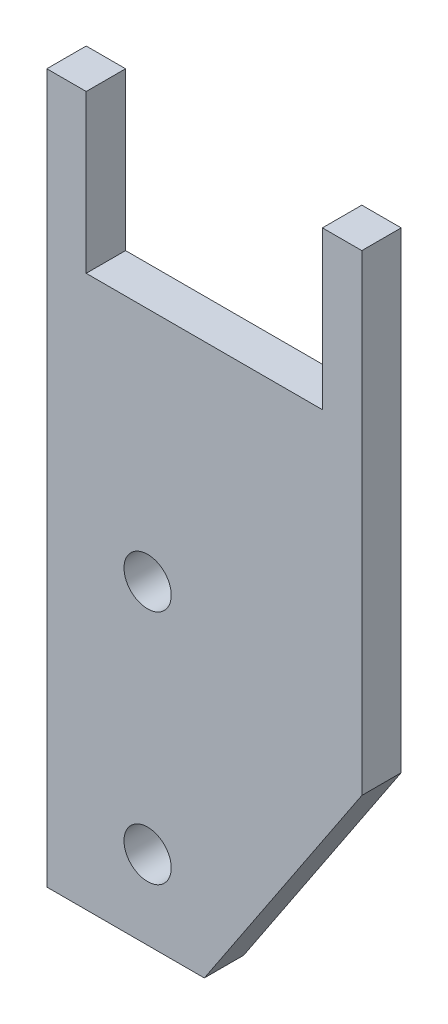
ISO-10303-21;
HEADER;
FILE_DESCRIPTION(('STEP AP214'),'2;1');
FILE_NAME('part.step','',(''),(''),'','','');
FILE_SCHEMA(('AUTOMOTIVE_DESIGN { 1 0 10303 214 1 1 1 1 }'));
ENDSEC;
DATA;
#1=APPLICATION_CONTEXT('core data for automotive mechanical design processes');
#2=APPLICATION_PROTOCOL_DEFINITION('international standard','automotive_design',2000,#1);
#3=PRODUCT_CONTEXT('',#1,'mechanical');
#4=PRODUCT('Part','Part','',(#3));
#5=PRODUCT_RELATED_PRODUCT_CATEGORY('part','',(#4));
#6=PRODUCT_DEFINITION_FORMATION('','',#4);
#7=PRODUCT_DEFINITION_CONTEXT('part definition',#1,'design');
#8=PRODUCT_DEFINITION('design','',#6,#7);
#9=PRODUCT_DEFINITION_SHAPE('','',#8);
#10=(LENGTH_UNIT() NAMED_UNIT(*) SI_UNIT(.MILLI.,.METRE.));
#11=(NAMED_UNIT(*) PLANE_ANGLE_UNIT() SI_UNIT($,.RADIAN.));
#12=(NAMED_UNIT(*) SI_UNIT($,.STERADIAN.) SOLID_ANGLE_UNIT());
#13=UNCERTAINTY_MEASURE_WITH_UNIT(LENGTH_MEASURE(1.E-05),#10,'distance_accuracy_value','');
#14=(GEOMETRIC_REPRESENTATION_CONTEXT(3) GLOBAL_UNCERTAINTY_ASSIGNED_CONTEXT((#13)) GLOBAL_UNIT_ASSIGNED_CONTEXT((#10,
#11,#12)) REPRESENTATION_CONTEXT('',''));
#15=CARTESIAN_POINT('',(0.,0.,0.));
#16=DIRECTION('',(0.,0.,1.));
#17=DIRECTION('',(1.,0.,0.));
#18=AXIS2_PLACEMENT_3D('',#15,#16,#17);
#19=CARTESIAN_POINT('',(0.,0.,6.35));
#20=DIRECTION('',(0.,0.,1.));
#21=DIRECTION('',(1.,0.,0.));
#22=AXIS2_PLACEMENT_3D('',#19,#20,#21);
#23=PLANE('',#22);
#24=CARTESIAN_POINT('',(9.906,-38.1,6.35));
#25=DIRECTION('',(0.,0.,1.));
#26=DIRECTION('',(1.,0.,0.));
#27=AXIS2_PLACEMENT_3D('',#24,#25,#26);
#28=CIRCLE('',#27,3.81);
#29=CARTESIAN_POINT('',(13.716,-38.1,6.35));
#30=VERTEX_POINT('',#29);
#31=EDGE_CURVE('E151',#30,#30,#28,.T.);
#32=ORIENTED_EDGE('',*,*,#31,.F.);
#33=EDGE_LOOP('',(#32));
#34=FACE_BOUND('',#33,.T.);
#35=DIRECTION('',(-1.,0.,0.));
#36=VECTOR('',#35,1.);
#37=CARTESIAN_POINT('',(0.,0.,6.35));
#38=LINE('',#37,#36);
#39=CARTESIAN_POINT('',(38.1,0.,6.35));
#40=VERTEX_POINT('',#39);
#41=CARTESIAN_POINT('',(0.,0.,6.35));
#42=VERTEX_POINT('',#41);
#43=EDGE_CURVE('E165',#40,#42,#38,.T.);
#44=ORIENTED_EDGE('',*,*,#43,.T.);
#45=DIRECTION('',(0.,1.,0.));
#46=VECTOR('',#45,1.);
#47=CARTESIAN_POINT('',(0.,0.,6.35));
#48=LINE('',#47,#46);
#49=CARTESIAN_POINT('',(0.,25.4,6.35));
#50=VERTEX_POINT('',#49);
#51=EDGE_CURVE('E108',#42,#50,#48,.T.);
#52=ORIENTED_EDGE('',*,*,#51,.T.);
#53=DIRECTION('',(-1.,0.,0.));
#54=VECTOR('',#53,1.);
#55=CARTESIAN_POINT('',(0.,25.4,6.35));
#56=LINE('',#55,#54);
#57=CARTESIAN_POINT('',(-6.35,25.4,6.35));
#58=VERTEX_POINT('',#57);
#59=EDGE_CURVE('E183',#50,#58,#56,.T.);
#60=ORIENTED_EDGE('',*,*,#59,.T.);
#61=DIRECTION('',(0.,-1.,0.));
#62=VECTOR('',#61,1.);
#63=CARTESIAN_POINT('',(-6.35,25.4,6.35));
#64=LINE('',#63,#62);
#65=CARTESIAN_POINT('',(-6.34999999999999,-88.9,6.35));
#66=VERTEX_POINT('',#65);
#67=EDGE_CURVE('E200',#58,#66,#64,.T.);
#68=ORIENTED_EDGE('',*,*,#67,.T.);
#69=DIRECTION('',(1.,0.,0.));
#70=VECTOR('',#69,1.);
#71=CARTESIAN_POINT('',(19.05,-88.9,6.35));
#72=LINE('',#71,#70);
#73=CARTESIAN_POINT('',(19.05,-88.9,6.35));
#74=VERTEX_POINT('',#73);
#75=EDGE_CURVE('E199',#66,#74,#72,.T.);
#76=ORIENTED_EDGE('',*,*,#75,.T.);
#77=DIRECTION('',(0.553730177057892,0.83269615768024,0.));
#78=VECTOR('',#77,1.);
#79=CARTESIAN_POINT('',(44.45,-50.7036305742701,6.35));
#80=LINE('',#79,#78);
#81=CARTESIAN_POINT('',(44.45,-50.7036305742701,6.35));
#82=VERTEX_POINT('',#81);
#83=EDGE_CURVE('E130',#74,#82,#80,.T.);
#84=ORIENTED_EDGE('',*,*,#83,.T.);
#85=DIRECTION('',(0.,1.,0.));
#86=VECTOR('',#85,1.);
#87=CARTESIAN_POINT('',(44.45,0.0963694257299225,6.35));
#88=LINE('',#87,#86);
#89=CARTESIAN_POINT('',(44.45,25.4,6.35));
#90=VERTEX_POINT('',#89);
#91=EDGE_CURVE('E124',#82,#90,#88,.T.);
#92=ORIENTED_EDGE('',*,*,#91,.T.);
#93=DIRECTION('',(-1.,0.,0.));
#94=VECTOR('',#93,1.);
#95=CARTESIAN_POINT('',(38.1,25.4,6.35));
#96=LINE('',#95,#94);
#97=CARTESIAN_POINT('',(38.1,25.4,6.35));
#98=VERTEX_POINT('',#97);
#99=EDGE_CURVE('E128',#90,#98,#96,.T.);
#100=ORIENTED_EDGE('',*,*,#99,.T.);
#101=DIRECTION('',(0.,-1.,0.));
#102=VECTOR('',#101,1.);
#103=CARTESIAN_POINT('',(38.1,0.,6.35));
#104=LINE('',#103,#102);
#105=EDGE_CURVE('E62',#98,#40,#104,.T.);
#106=ORIENTED_EDGE('',*,*,#105,.T.);
#107=EDGE_LOOP('',(#44,#52,#60,#68,#76,#84,#92,#100,#106));
#108=FACE_BOUND('',#107,.T.);
#109=CARTESIAN_POINT('',(9.906,-76.2,6.35));
#110=DIRECTION('',(0.,0.,1.));
#111=DIRECTION('',(1.,0.,0.));
#112=AXIS2_PLACEMENT_3D('',#109,#110,#111);
#113=CIRCLE('',#112,3.81);
#114=CARTESIAN_POINT('',(13.716,-76.2,6.35));
#115=VERTEX_POINT('',#114);
#116=EDGE_CURVE('E210',#115,#115,#113,.T.);
#117=ORIENTED_EDGE('',*,*,#116,.F.);
#118=EDGE_LOOP('',(#117));
#119=FACE_BOUND('',#118,.T.);
#120=ADVANCED_FACE('F45',(#34,#108,#119),#23,.T.);
#121=CARTESIAN_POINT('',(0.,0.,0.));
#122=DIRECTION('',(0.,0.,1.));
#123=DIRECTION('',(1.,0.,0.));
#124=AXIS2_PLACEMENT_3D('',#121,#122,#123);
#125=PLANE('',#124);
#126=DIRECTION('',(-1.,0.,0.));
#127=VECTOR('',#126,1.);
#128=CARTESIAN_POINT('',(0.,0.,0.));
#129=LINE('',#128,#127);
#130=CARTESIAN_POINT('',(38.1,0.,0.));
#131=VERTEX_POINT('',#130);
#132=CARTESIAN_POINT('',(0.,0.,0.));
#133=VERTEX_POINT('',#132);
#134=EDGE_CURVE('E147',#131,#133,#129,.T.);
#135=ORIENTED_EDGE('',*,*,#134,.F.);
#136=DIRECTION('',(0.,-1.,0.));
#137=VECTOR('',#136,1.);
#138=CARTESIAN_POINT('',(38.1,0.,0.));
#139=LINE('',#138,#137);
#140=CARTESIAN_POINT('',(38.1,25.4,0.));
#141=VERTEX_POINT('',#140);
#142=EDGE_CURVE('E100',#141,#131,#139,.T.);
#143=ORIENTED_EDGE('',*,*,#142,.F.);
#144=DIRECTION('',(-1.,0.,0.));
#145=VECTOR('',#144,1.);
#146=CARTESIAN_POINT('',(38.1,25.4,0.));
#147=LINE('',#146,#145);
#148=CARTESIAN_POINT('',(44.45,25.4,0.));
#149=VERTEX_POINT('',#148);
#150=EDGE_CURVE('E94',#149,#141,#147,.T.);
#151=ORIENTED_EDGE('',*,*,#150,.F.);
#152=DIRECTION('',(0.,1.,0.));
#153=VECTOR('',#152,1.);
#154=CARTESIAN_POINT('',(44.45,25.4,0.));
#155=LINE('',#154,#153);
#156=CARTESIAN_POINT('',(44.45,-50.7036305742701,0.));
#157=VERTEX_POINT('',#156);
#158=EDGE_CURVE('E137',#157,#149,#155,.T.);
#159=ORIENTED_EDGE('',*,*,#158,.F.);
#160=DIRECTION('',(0.553730177057892,0.83269615768024,0.));
#161=VECTOR('',#160,1.);
#162=CARTESIAN_POINT('',(44.45,-50.7036305742701,0.));
#163=LINE('',#162,#161);
#164=CARTESIAN_POINT('',(19.05,-88.9,0.));
#165=VERTEX_POINT('',#164);
#166=EDGE_CURVE('E159',#165,#157,#163,.T.);
#167=ORIENTED_EDGE('',*,*,#166,.F.);
#168=DIRECTION('',(1.,0.,0.));
#169=VECTOR('',#168,1.);
#170=CARTESIAN_POINT('',(19.05,-88.9,0.));
#171=LINE('',#170,#169);
#172=CARTESIAN_POINT('',(-6.34999999999999,-88.9,0.));
#173=VERTEX_POINT('',#172);
#174=EDGE_CURVE('E157',#173,#165,#171,.T.);
#175=ORIENTED_EDGE('',*,*,#174,.F.);
#176=DIRECTION('',(0.,-1.,0.));
#177=VECTOR('',#176,1.);
#178=CARTESIAN_POINT('',(-6.35,25.4,0.));
#179=LINE('',#178,#177);
#180=CARTESIAN_POINT('',(-6.35,25.4,0.));
#181=VERTEX_POINT('',#180);
#182=EDGE_CURVE('E155',#181,#173,#179,.T.);
#183=ORIENTED_EDGE('',*,*,#182,.F.);
#184=DIRECTION('',(-1.,0.,0.));
#185=VECTOR('',#184,1.);
#186=CARTESIAN_POINT('',(0.,25.4,0.));
#187=LINE('',#186,#185);
#188=CARTESIAN_POINT('',(0.,25.4,0.));
#189=VERTEX_POINT('',#188);
#190=EDGE_CURVE('E153',#189,#181,#187,.T.);
#191=ORIENTED_EDGE('',*,*,#190,.F.);
#192=DIRECTION('',(0.,1.,0.));
#193=VECTOR('',#192,1.);
#194=CARTESIAN_POINT('',(0.,0.,0.));
#195=LINE('',#194,#193);
#196=EDGE_CURVE('E150',#133,#189,#195,.T.);
#197=ORIENTED_EDGE('',*,*,#196,.F.);
#198=EDGE_LOOP('',(#135,#143,#151,#159,#167,#175,#183,#191,#197));
#199=FACE_BOUND('',#198,.T.);
#200=CARTESIAN_POINT('',(9.906,-38.1,0.));
#201=DIRECTION('',(0.,0.,1.));
#202=DIRECTION('',(1.,0.,0.));
#203=AXIS2_PLACEMENT_3D('',#200,#201,#202);
#204=CIRCLE('',#203,3.81);
#205=CARTESIAN_POINT('',(13.716,-38.1,0.));
#206=VERTEX_POINT('',#205);
#207=EDGE_CURVE('E207',#206,#206,#204,.T.);
#208=ORIENTED_EDGE('',*,*,#207,.T.);
#209=EDGE_LOOP('',(#208));
#210=FACE_BOUND('',#209,.T.);
#211=CARTESIAN_POINT('',(9.906,-76.2,0.));
#212=DIRECTION('',(0.,0.,1.));
#213=DIRECTION('',(1.,0.,0.));
#214=AXIS2_PLACEMENT_3D('',#211,#212,#213);
#215=CIRCLE('',#214,3.81);
#216=CARTESIAN_POINT('',(13.716,-76.2,0.));
#217=VERTEX_POINT('',#216);
#218=EDGE_CURVE('E213',#217,#217,#215,.T.);
#219=ORIENTED_EDGE('',*,*,#218,.T.);
#220=EDGE_LOOP('',(#219));
#221=FACE_BOUND('',#220,.T.);
#222=ADVANCED_FACE('F187',(#199,#210,#221),#125,.F.);
#223=CARTESIAN_POINT('',(0.,0.,6.35));
#224=DIRECTION('',(0.,-1.,0.));
#225=DIRECTION('',(0.,0.,-1.));
#226=AXIS2_PLACEMENT_3D('',#223,#224,#225);
#227=PLANE('',#226);
#228=ORIENTED_EDGE('',*,*,#134,.T.);
#229=DIRECTION('',(0.,0.,-1.));
#230=VECTOR('',#229,1.);
#231=CARTESIAN_POINT('',(0.,0.,6.35));
#232=LINE('',#231,#230);
#233=EDGE_CURVE('E11',#42,#133,#232,.T.);
#234=ORIENTED_EDGE('',*,*,#233,.F.);
#235=ORIENTED_EDGE('',*,*,#43,.F.);
#236=DIRECTION('',(0.,0.,-1.));
#237=VECTOR('',#236,1.);
#238=CARTESIAN_POINT('',(38.1,0.,6.35));
#239=LINE('',#238,#237);
#240=EDGE_CURVE('E143',#40,#131,#239,.T.);
#241=ORIENTED_EDGE('',*,*,#240,.T.);
#242=EDGE_LOOP('',(#228,#234,#235,#241));
#243=FACE_BOUND('',#242,.T.);
#244=ADVANCED_FACE('F47',(#243),#227,.F.);
#245=CARTESIAN_POINT('',(0.,0.,6.35));
#246=DIRECTION('',(-1.,0.,0.));
#247=DIRECTION('',(0.,0.,1.));
#248=AXIS2_PLACEMENT_3D('',#245,#246,#247);
#249=PLANE('',#248);
#250=ORIENTED_EDGE('',*,*,#196,.T.);
#251=DIRECTION('',(0.,0.,-1.));
#252=VECTOR('',#251,1.);
#253=CARTESIAN_POINT('',(0.,25.4,6.35));
#254=LINE('',#253,#252);
#255=EDGE_CURVE('E54',#50,#189,#254,.T.);
#256=ORIENTED_EDGE('',*,*,#255,.F.);
#257=ORIENTED_EDGE('',*,*,#51,.F.);
#258=ORIENTED_EDGE('',*,*,#233,.T.);
#259=EDGE_LOOP('',(#250,#256,#257,#258));
#260=FACE_BOUND('',#259,.T.);
#261=ADVANCED_FACE('F249',(#260),#249,.F.);
#262=CARTESIAN_POINT('',(0.,25.4,6.35));
#263=DIRECTION('',(0.,-1.,0.));
#264=DIRECTION('',(0.,0.,-1.));
#265=AXIS2_PLACEMENT_3D('',#262,#263,#264);
#266=PLANE('',#265);
#267=ORIENTED_EDGE('',*,*,#190,.T.);
#268=DIRECTION('',(0.,0.,-1.));
#269=VECTOR('',#268,1.);
#270=CARTESIAN_POINT('',(-6.35,25.4,6.35));
#271=LINE('',#270,#269);
#272=EDGE_CURVE('E175',#58,#181,#271,.T.);
#273=ORIENTED_EDGE('',*,*,#272,.F.);
#274=ORIENTED_EDGE('',*,*,#59,.F.);
#275=ORIENTED_EDGE('',*,*,#255,.T.);
#276=EDGE_LOOP('',(#267,#273,#274,#275));
#277=FACE_BOUND('',#276,.T.);
#278=ADVANCED_FACE('F181',(#277),#266,.F.);
#279=CARTESIAN_POINT('',(-6.35,25.4,6.35));
#280=DIRECTION('',(1.,0.,0.));
#281=DIRECTION('',(0.,1.,0.));
#282=AXIS2_PLACEMENT_3D('',#279,#280,#281);
#283=PLANE('',#282);
#284=ORIENTED_EDGE('',*,*,#182,.T.);
#285=DIRECTION('',(0.,0.,-1.));
#286=VECTOR('',#285,1.);
#287=CARTESIAN_POINT('',(-6.34999999999999,-88.9,6.35));
#288=LINE('',#287,#286);
#289=EDGE_CURVE('E172',#66,#173,#288,.T.);
#290=ORIENTED_EDGE('',*,*,#289,.F.);
#291=ORIENTED_EDGE('',*,*,#67,.F.);
#292=ORIENTED_EDGE('',*,*,#272,.T.);
#293=EDGE_LOOP('',(#284,#290,#291,#292));
#294=FACE_BOUND('',#293,.T.);
#295=ADVANCED_FACE('F193',(#294),#283,.F.);
#296=CARTESIAN_POINT('',(19.05,-88.9,6.35));
#297=DIRECTION('',(0.,1.,0.));
#298=DIRECTION('',(0.,0.,1.));
#299=AXIS2_PLACEMENT_3D('',#296,#297,#298);
#300=PLANE('',#299);
#301=ORIENTED_EDGE('',*,*,#174,.T.);
#302=DIRECTION('',(0.,0.,-1.));
#303=VECTOR('',#302,1.);
#304=CARTESIAN_POINT('',(19.05,-88.9,6.35));
#305=LINE('',#304,#303);
#306=EDGE_CURVE('E169',#74,#165,#305,.T.);
#307=ORIENTED_EDGE('',*,*,#306,.F.);
#308=ORIENTED_EDGE('',*,*,#75,.F.);
#309=ORIENTED_EDGE('',*,*,#289,.T.);
#310=EDGE_LOOP('',(#301,#307,#308,#309));
#311=FACE_BOUND('',#310,.T.);
#312=ADVANCED_FACE('F197',(#311),#300,.F.);
#313=CARTESIAN_POINT('',(44.45,-50.7036305742701,6.35));
#314=DIRECTION('',(-0.83269615768024,0.553730177057892,0.));
#315=DIRECTION('',(-0.553730177057892,-0.83269615768024,0.));
#316=AXIS2_PLACEMENT_3D('',#313,#314,#315);
#317=PLANE('',#316);
#318=ORIENTED_EDGE('',*,*,#166,.T.);
#319=DIRECTION('',(0.,0.,-1.));
#320=VECTOR('',#319,1.);
#321=CARTESIAN_POINT('',(44.45,-50.7036305742701,6.35));
#322=LINE('',#321,#320);
#323=EDGE_CURVE('E138',#82,#157,#322,.T.);
#324=ORIENTED_EDGE('',*,*,#323,.F.);
#325=ORIENTED_EDGE('',*,*,#83,.F.);
#326=ORIENTED_EDGE('',*,*,#306,.T.);
#327=EDGE_LOOP('',(#318,#324,#325,#326));
#328=FACE_BOUND('',#327,.T.);
#329=ADVANCED_FACE('F240',(#328),#317,.F.);
#330=CARTESIAN_POINT('',(44.45,25.4,6.35));
#331=DIRECTION('',(-1.,0.,0.));
#332=DIRECTION('',(0.,-1.,0.));
#333=AXIS2_PLACEMENT_3D('',#330,#331,#332);
#334=PLANE('',#333);
#335=ORIENTED_EDGE('',*,*,#158,.T.);
#336=DIRECTION('',(0.,0.,-1.));
#337=VECTOR('',#336,1.);
#338=CARTESIAN_POINT('',(44.45,25.4,6.35));
#339=LINE('',#338,#337);
#340=EDGE_CURVE('E135',#90,#149,#339,.T.);
#341=ORIENTED_EDGE('',*,*,#340,.F.);
#342=ORIENTED_EDGE('',*,*,#91,.F.);
#343=ORIENTED_EDGE('',*,*,#323,.T.);
#344=EDGE_LOOP('',(#335,#341,#342,#343));
#345=FACE_BOUND('',#344,.T.);
#346=ADVANCED_FACE('F136',(#345),#334,.F.);
#347=CARTESIAN_POINT('',(38.1,25.4,6.35));
#348=DIRECTION('',(0.,-1.,0.));
#349=DIRECTION('',(0.,0.,-1.));
#350=AXIS2_PLACEMENT_3D('',#347,#348,#349);
#351=PLANE('',#350);
#352=ORIENTED_EDGE('',*,*,#150,.T.);
#353=DIRECTION('',(0.,0.,-1.));
#354=VECTOR('',#353,1.);
#355=CARTESIAN_POINT('',(38.1,25.4,6.35));
#356=LINE('',#355,#354);
#357=EDGE_CURVE('E139',#98,#141,#356,.T.);
#358=ORIENTED_EDGE('',*,*,#357,.F.);
#359=ORIENTED_EDGE('',*,*,#99,.F.);
#360=ORIENTED_EDGE('',*,*,#340,.T.);
#361=EDGE_LOOP('',(#352,#358,#359,#360));
#362=FACE_BOUND('',#361,.T.);
#363=ADVANCED_FACE('F141',(#362),#351,.F.);
#364=CARTESIAN_POINT('',(38.1,0.,6.35));
#365=DIRECTION('',(1.,0.,0.));
#366=DIRECTION('',(0.,0.,-1.));
#367=AXIS2_PLACEMENT_3D('',#364,#365,#366);
#368=PLANE('',#367);
#369=ORIENTED_EDGE('',*,*,#142,.T.);
#370=ORIENTED_EDGE('',*,*,#240,.F.);
#371=ORIENTED_EDGE('',*,*,#105,.F.);
#372=ORIENTED_EDGE('',*,*,#357,.T.);
#373=EDGE_LOOP('',(#369,#370,#371,#372));
#374=FACE_BOUND('',#373,.T.);
#375=ADVANCED_FACE('F233',(#374),#368,.F.);
#376=CARTESIAN_POINT('',(9.906,-38.1,6.35));
#377=DIRECTION('',(0.,0.,-1.));
#378=DIRECTION('',(-1.,0.,0.));
#379=AXIS2_PLACEMENT_3D('',#376,#377,#378);
#380=CYLINDRICAL_SURFACE('',#379,3.81);
#381=ORIENTED_EDGE('',*,*,#31,.T.);
#382=EDGE_LOOP('',(#381));
#383=FACE_BOUND('',#382,.T.);
#384=ORIENTED_EDGE('',*,*,#207,.F.);
#385=EDGE_LOOP('',(#384));
#386=FACE_BOUND('',#385,.T.);
#387=ADVANCED_FACE('F230',(#383,#386),#380,.F.);
#388=CARTESIAN_POINT('',(9.906,-76.2,6.35));
#389=DIRECTION('',(0.,0.,-1.));
#390=DIRECTION('',(-1.,0.,0.));
#391=AXIS2_PLACEMENT_3D('',#388,#389,#390);
#392=CYLINDRICAL_SURFACE('',#391,3.81);
#393=ORIENTED_EDGE('',*,*,#116,.T.);
#394=EDGE_LOOP('',(#393));
#395=FACE_BOUND('',#394,.T.);
#396=ORIENTED_EDGE('',*,*,#218,.F.);
#397=EDGE_LOOP('',(#396));
#398=FACE_BOUND('',#397,.T.);
#399=ADVANCED_FACE('F219',(#395,#398),#392,.F.);
#400=CLOSED_SHELL('',(#120,#222,#244,#261,#278,#295,#312,#329,#346,#363,#375,#387,#399));
#401=MANIFOLD_SOLID_BREP('B2',#400);
#402=ADVANCED_BREP_SHAPE_REPRESENTATION('',(#18,#401),#14);
#403=SHAPE_DEFINITION_REPRESENTATION(#9,#402);
ENDSEC;
END-ISO-10303-21;
